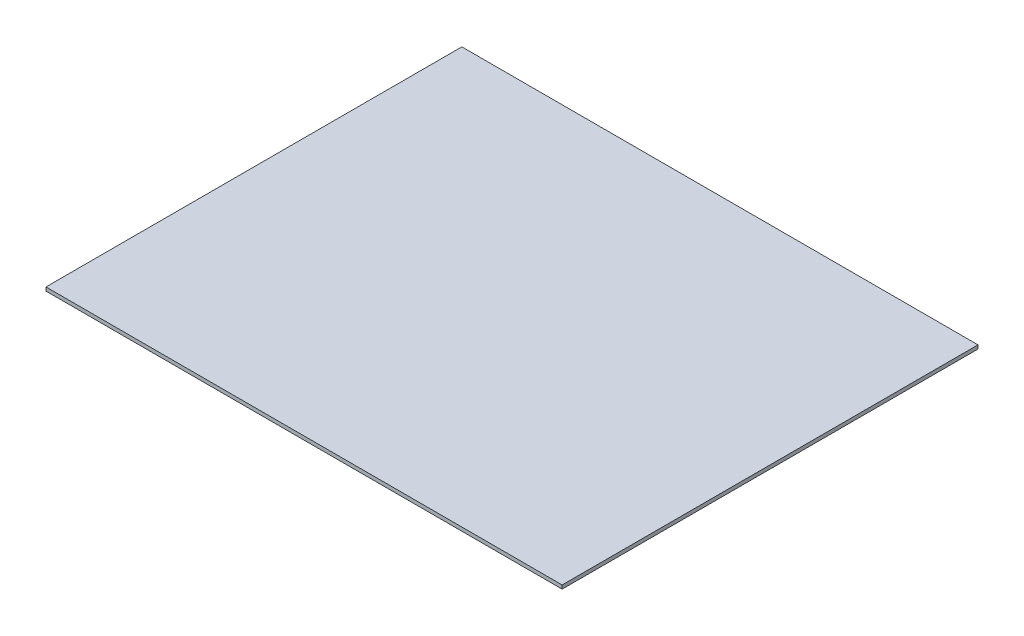
ISO-10303-21;
HEADER;
FILE_DESCRIPTION(('STEP AP214'),'2;1');
FILE_NAME('part.step','',(''),(''),'','','');
FILE_SCHEMA(('AUTOMOTIVE_DESIGN { 1 0 10303 214 1 1 1 1 }'));
ENDSEC;
DATA;
#1=APPLICATION_CONTEXT('core data for automotive mechanical design processes');
#2=APPLICATION_PROTOCOL_DEFINITION('international standard','automotive_design',2000,#1);
#3=PRODUCT_CONTEXT('',#1,'mechanical');
#4=PRODUCT('Part','Part','',(#3));
#5=PRODUCT_RELATED_PRODUCT_CATEGORY('part','',(#4));
#6=PRODUCT_DEFINITION_FORMATION('','',#4);
#7=PRODUCT_DEFINITION_CONTEXT('part definition',#1,'design');
#8=PRODUCT_DEFINITION('design','',#6,#7);
#9=PRODUCT_DEFINITION_SHAPE('','',#8);
#10=(LENGTH_UNIT() NAMED_UNIT(*) SI_UNIT(.MILLI.,.METRE.));
#11=(NAMED_UNIT(*) PLANE_ANGLE_UNIT() SI_UNIT($,.RADIAN.));
#12=(NAMED_UNIT(*) SI_UNIT($,.STERADIAN.) SOLID_ANGLE_UNIT());
#13=UNCERTAINTY_MEASURE_WITH_UNIT(LENGTH_MEASURE(1.E-05),#10,'distance_accuracy_value','');
#14=(GEOMETRIC_REPRESENTATION_CONTEXT(3) GLOBAL_UNCERTAINTY_ASSIGNED_CONTEXT((#13)) GLOBAL_UNIT_ASSIGNED_CONTEXT((#10,
#11,#12)) REPRESENTATION_CONTEXT('',''));
#15=CARTESIAN_POINT('',(0.,0.,0.));
#16=DIRECTION('',(0.,0.,1.));
#17=DIRECTION('',(1.,0.,0.));
#18=AXIS2_PLACEMENT_3D('',#15,#16,#17);
#19=CARTESIAN_POINT('',(123.5,1.75,-99.5));
#20=DIRECTION('',(-1.,0.,0.));
#21=DIRECTION('',(0.,0.,1.));
#22=AXIS2_PLACEMENT_3D('',#19,#20,#21);
#23=PLANE('',#22);
#24=DIRECTION('',(0.,0.,-1.));
#25=VECTOR('',#24,1.);
#26=CARTESIAN_POINT('',(123.5,0.,-99.5));
#27=LINE('',#26,#25);
#28=CARTESIAN_POINT('',(123.5,0.,99.5));
#29=VERTEX_POINT('',#28);
#30=CARTESIAN_POINT('',(123.5,0.,-99.5));
#31=VERTEX_POINT('',#30);
#32=EDGE_CURVE('E97',#29,#31,#27,.T.);
#33=ORIENTED_EDGE('',*,*,#32,.T.);
#34=DIRECTION('',(0.,-1.,0.));
#35=VECTOR('',#34,1.);
#36=CARTESIAN_POINT('',(123.5,1.75,-99.5));
#37=LINE('',#36,#35);
#38=CARTESIAN_POINT('',(123.5,1.75,-99.5));
#39=VERTEX_POINT('',#38);
#40=EDGE_CURVE('E11',#39,#31,#37,.T.);
#41=ORIENTED_EDGE('',*,*,#40,.F.);
#42=DIRECTION('',(0.,0.,-1.));
#43=VECTOR('',#42,1.);
#44=CARTESIAN_POINT('',(123.5,1.75,-99.5));
#45=LINE('',#44,#43);
#46=CARTESIAN_POINT('',(123.5,1.75,99.5));
#47=VERTEX_POINT('',#46);
#48=EDGE_CURVE('E85',#47,#39,#45,.T.);
#49=ORIENTED_EDGE('',*,*,#48,.F.);
#50=DIRECTION('',(0.,-1.,0.));
#51=VECTOR('',#50,1.);
#52=CARTESIAN_POINT('',(123.5,1.75,99.5));
#53=LINE('',#52,#51);
#54=EDGE_CURVE('E93',#47,#29,#53,.T.);
#55=ORIENTED_EDGE('',*,*,#54,.T.);
#56=EDGE_LOOP('',(#33,#41,#49,#55));
#57=FACE_BOUND('',#56,.T.);
#58=ADVANCED_FACE('F34',(#57),#23,.F.);
#59=CARTESIAN_POINT('',(-123.5,1.75,-99.5));
#60=DIRECTION('',(0.,0.,1.));
#61=DIRECTION('',(1.,0.,0.));
#62=AXIS2_PLACEMENT_3D('',#59,#60,#61);
#63=PLANE('',#62);
#64=DIRECTION('',(-1.,0.,0.));
#65=VECTOR('',#64,1.);
#66=CARTESIAN_POINT('',(-123.5,0.,-99.5));
#67=LINE('',#66,#65);
#68=CARTESIAN_POINT('',(-123.5,0.,-99.5));
#69=VERTEX_POINT('',#68);
#70=EDGE_CURVE('E89',#31,#69,#67,.T.);
#71=ORIENTED_EDGE('',*,*,#70,.T.);
#72=DIRECTION('',(0.,-1.,0.));
#73=VECTOR('',#72,1.);
#74=CARTESIAN_POINT('',(-123.5,1.75,-99.5));
#75=LINE('',#74,#73);
#76=CARTESIAN_POINT('',(-123.5,1.75,-99.5));
#77=VERTEX_POINT('',#76);
#78=EDGE_CURVE('E42',#77,#69,#75,.T.);
#79=ORIENTED_EDGE('',*,*,#78,.F.);
#80=DIRECTION('',(-1.,0.,0.));
#81=VECTOR('',#80,1.);
#82=CARTESIAN_POINT('',(-123.5,1.75,-99.5));
#83=LINE('',#82,#81);
#84=EDGE_CURVE('E80',#39,#77,#83,.T.);
#85=ORIENTED_EDGE('',*,*,#84,.F.);
#86=ORIENTED_EDGE('',*,*,#40,.T.);
#87=EDGE_LOOP('',(#71,#79,#85,#86));
#88=FACE_BOUND('',#87,.T.);
#89=ADVANCED_FACE('F88',(#88),#63,.F.);
#90=CARTESIAN_POINT('',(-123.5,1.75,-99.5));
#91=DIRECTION('',(1.,0.,0.));
#92=DIRECTION('',(0.,0.,-1.));
#93=AXIS2_PLACEMENT_3D('',#90,#91,#92);
#94=PLANE('',#93);
#95=DIRECTION('',(0.,0.,1.));
#96=VECTOR('',#95,1.);
#97=CARTESIAN_POINT('',(-123.5,0.,-99.5));
#98=LINE('',#97,#96);
#99=CARTESIAN_POINT('',(-123.5,0.,99.5));
#100=VERTEX_POINT('',#99);
#101=EDGE_CURVE('E67',#69,#100,#98,.T.);
#102=ORIENTED_EDGE('',*,*,#101,.T.);
#103=DIRECTION('',(0.,-1.,0.));
#104=VECTOR('',#103,1.);
#105=CARTESIAN_POINT('',(-123.5,1.75,99.5));
#106=LINE('',#105,#104);
#107=CARTESIAN_POINT('',(-123.5,1.75,99.5));
#108=VERTEX_POINT('',#107);
#109=EDGE_CURVE('E90',#108,#100,#106,.T.);
#110=ORIENTED_EDGE('',*,*,#109,.F.);
#111=DIRECTION('',(0.,0.,1.));
#112=VECTOR('',#111,1.);
#113=CARTESIAN_POINT('',(-123.5,1.75,-99.5));
#114=LINE('',#113,#112);
#115=EDGE_CURVE('E83',#77,#108,#114,.T.);
#116=ORIENTED_EDGE('',*,*,#115,.F.);
#117=ORIENTED_EDGE('',*,*,#78,.T.);
#118=EDGE_LOOP('',(#102,#110,#116,#117));
#119=FACE_BOUND('',#118,.T.);
#120=ADVANCED_FACE('F91',(#119),#94,.F.);
#121=CARTESIAN_POINT('',(-123.5,1.75,99.5));
#122=DIRECTION('',(0.,0.,-1.));
#123=DIRECTION('',(-1.,0.,0.));
#124=AXIS2_PLACEMENT_3D('',#121,#122,#123);
#125=PLANE('',#124);
#126=DIRECTION('',(1.,0.,0.));
#127=VECTOR('',#126,1.);
#128=CARTESIAN_POINT('',(-123.5,0.,99.5));
#129=LINE('',#128,#127);
#130=EDGE_CURVE('E73',#100,#29,#129,.T.);
#131=ORIENTED_EDGE('',*,*,#130,.T.);
#132=ORIENTED_EDGE('',*,*,#54,.F.);
#133=DIRECTION('',(1.,0.,0.));
#134=VECTOR('',#133,1.);
#135=CARTESIAN_POINT('',(-123.5,1.75,99.5));
#136=LINE('',#135,#134);
#137=EDGE_CURVE('E50',#108,#47,#136,.T.);
#138=ORIENTED_EDGE('',*,*,#137,.F.);
#139=ORIENTED_EDGE('',*,*,#109,.T.);
#140=EDGE_LOOP('',(#131,#132,#138,#139));
#141=FACE_BOUND('',#140,.T.);
#142=ADVANCED_FACE('F104',(#141),#125,.F.);
#143=CARTESIAN_POINT('',(0.,1.75,0.));
#144=DIRECTION('',(0.,1.,0.));
#145=DIRECTION('',(0.,0.,1.));
#146=AXIS2_PLACEMENT_3D('',#143,#144,#145);
#147=PLANE('',#146);
#148=ORIENTED_EDGE('',*,*,#48,.T.);
#149=ORIENTED_EDGE('',*,*,#84,.T.);
#150=ORIENTED_EDGE('',*,*,#115,.T.);
#151=ORIENTED_EDGE('',*,*,#137,.T.);
#152=EDGE_LOOP('',(#148,#149,#150,#151));
#153=FACE_BOUND('',#152,.T.);
#154=ADVANCED_FACE('F81',(#153),#147,.T.);
#155=CARTESIAN_POINT('',(0.,0.,0.));
#156=DIRECTION('',(0.,1.,0.));
#157=DIRECTION('',(0.,0.,1.));
#158=AXIS2_PLACEMENT_3D('',#155,#156,#157);
#159=PLANE('',#158);
#160=ORIENTED_EDGE('',*,*,#32,.F.);
#161=ORIENTED_EDGE('',*,*,#130,.F.);
#162=ORIENTED_EDGE('',*,*,#101,.F.);
#163=ORIENTED_EDGE('',*,*,#70,.F.);
#164=EDGE_LOOP('',(#160,#161,#162,#163));
#165=FACE_BOUND('',#164,.T.);
#166=ADVANCED_FACE('F107',(#165),#159,.F.);
#167=CLOSED_SHELL('',(#58,#89,#120,#142,#154,#166));
#168=MANIFOLD_SOLID_BREP('B2',#167);
#169=ADVANCED_BREP_SHAPE_REPRESENTATION('',(#18,#168),#14);
#170=SHAPE_DEFINITION_REPRESENTATION(#9,#169);
ENDSEC;
END-ISO-10303-21;
